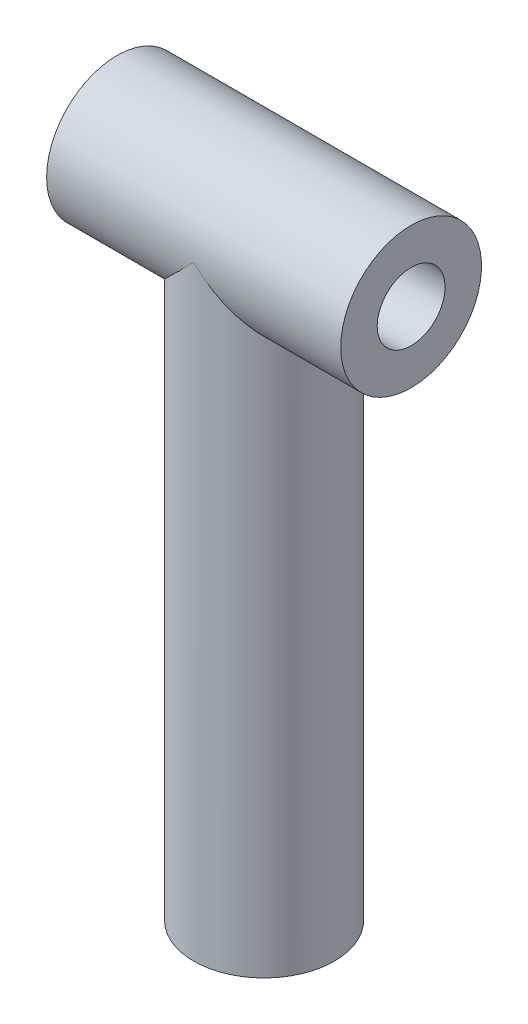
ISO-10303-21;
HEADER;
FILE_DESCRIPTION(('STEP AP214'),'2;1');
FILE_NAME('part.step','',(''),(''),'','','');
FILE_SCHEMA(('AUTOMOTIVE_DESIGN { 1 0 10303 214 1 1 1 1 }'));
ENDSEC;
DATA;
#1=APPLICATION_CONTEXT('core data for automotive mechanical design processes');
#2=APPLICATION_PROTOCOL_DEFINITION('international standard','automotive_design',2000,#1);
#3=PRODUCT_CONTEXT('',#1,'mechanical');
#4=PRODUCT('Part','Part','',(#3));
#5=PRODUCT_RELATED_PRODUCT_CATEGORY('part','',(#4));
#6=PRODUCT_DEFINITION_FORMATION('','',#4);
#7=PRODUCT_DEFINITION_CONTEXT('part definition',#1,'design');
#8=PRODUCT_DEFINITION('design','',#6,#7);
#9=PRODUCT_DEFINITION_SHAPE('','',#8);
#10=(LENGTH_UNIT() NAMED_UNIT(*) SI_UNIT(.MILLI.,.METRE.));
#11=(NAMED_UNIT(*) PLANE_ANGLE_UNIT() SI_UNIT($,.RADIAN.));
#12=(NAMED_UNIT(*) SI_UNIT($,.STERADIAN.) SOLID_ANGLE_UNIT());
#13=UNCERTAINTY_MEASURE_WITH_UNIT(LENGTH_MEASURE(1.E-05),#10,'distance_accuracy_value','');
#14=(GEOMETRIC_REPRESENTATION_CONTEXT(3) GLOBAL_UNCERTAINTY_ASSIGNED_CONTEXT((#13)) GLOBAL_UNIT_ASSIGNED_CONTEXT((#10,
#11,#12)) REPRESENTATION_CONTEXT('',''));
#15=CARTESIAN_POINT('',(0.,0.,0.));
#16=DIRECTION('',(0.,0.,1.));
#17=DIRECTION('',(1.,0.,0.));
#18=AXIS2_PLACEMENT_3D('',#15,#16,#17);
#19=CARTESIAN_POINT('',(0.,-107.,0.));
#20=DIRECTION('',(0.,1.,0.));
#21=DIRECTION('',(-1.,0.,0.));
#22=AXIS2_PLACEMENT_3D('',#19,#20,#21);
#23=CYLINDRICAL_SURFACE('',#22,5.);
#24=CARTESIAN_POINT('',(0.,-107.,0.));
#25=DIRECTION('',(0.,-1.,0.));
#26=DIRECTION('',(0.,0.,-1.));
#27=AXIS2_PLACEMENT_3D('',#24,#25,#26);
#28=CIRCLE('',#27,5.);
#29=CARTESIAN_POINT('',(0.,-107.,-5.));
#30=VERTEX_POINT('',#29);
#31=EDGE_CURVE('E98',#30,#30,#28,.T.);
#32=ORIENTED_EDGE('',*,*,#31,.T.);
#33=EDGE_LOOP('',(#32));
#34=FACE_BOUND('',#33,.T.);
#35=CARTESIAN_POINT('',(-5.,-12.445,0.));
#36=CARTESIAN_POINT('',(-4.99999921047016,-12.4449993836226,0.134380254248716));
#37=CARTESIAN_POINT('',(-4.99457509902374,-12.4428173961819,0.268811701853451));
#38=CARTESIAN_POINT('',(-4.97292780578596,-12.4341441176473,0.536722817996621));
#39=CARTESIAN_POINT('',(-4.95669745091969,-12.427649964189,0.67020179477194));
#40=CARTESIAN_POINT('',(-4.91355483179077,-12.4105057675391,0.935450702998557));
#41=CARTESIAN_POINT('',(-4.8866197706602,-12.399846855851,1.06721636325314));
#42=CARTESIAN_POINT('',(-4.82232747810782,-12.3746512557263,1.32785009255037));
#43=CARTESIAN_POINT('',(-4.78496598766992,-12.3601129827441,1.45671695418947));
#44=CARTESIAN_POINT('',(-4.70032985845046,-12.3275952396027,1.7101684260216));
#45=CARTESIAN_POINT('',(-4.65309264120023,-12.3096287814945,1.83476719187736));
#46=CARTESIAN_POINT('',(-4.54903318547114,-12.270672675897,2.079422416411));
#47=CARTESIAN_POINT('',(-4.49220736643891,-12.2496818995032,2.19947715769068));
#48=CARTESIAN_POINT('',(-4.30807871747373,-12.1829562937423,2.55155778451658));
#49=CARTESIAN_POINT('',(-4.16700669253554,-12.1334210621928,2.77585066122813));
#50=CARTESIAN_POINT('',(-3.84535504230426,-12.0266700031555,3.20764348432933));
#51=CARTESIAN_POINT('',(-3.66333069302464,-11.9692146605407,3.41399770947514));
#52=CARTESIAN_POINT('',(-3.26776469169965,-11.8541390779141,3.79432502613101));
#53=CARTESIAN_POINT('',(-3.05420759279374,-11.7965187707346,3.96828215238306));
#54=CARTESIAN_POINT('',(-2.70894461457719,-11.7133741209669,4.20503800338128));
#55=CARTESIAN_POINT('',(-2.58677461876584,-11.6856481327156,4.28128417227532));
#56=CARTESIAN_POINT('',(-2.33591639867659,-11.6326920062783,4.42314649094717));
#57=CARTESIAN_POINT('',(-2.20723088556697,-11.6074608426701,4.48876701520613));
#58=CARTESIAN_POINT('',(-1.94414888362959,-11.5603196732421,4.60881761007232));
#59=CARTESIAN_POINT('',(-1.80975202357346,-11.5384098837304,4.66324695192411));
#60=CARTESIAN_POINT('',(-1.53625430263286,-11.4986875533763,4.76035329833519));
#61=CARTESIAN_POINT('',(-1.39715584407928,-11.480872955296,4.80303620590282));
#62=CARTESIAN_POINT('',(-1.12164575793701,-11.4506865516449,4.8745503573854));
#63=CARTESIAN_POINT('',(-0.985397001964823,-11.438105076384,4.90392062765328));
#64=CARTESIAN_POINT('',(-0.710630029921596,-11.4177171072832,4.95120455235665));
#65=CARTESIAN_POINT('',(-0.572112870401013,-11.4099084519124,4.96912339312245));
#66=CARTESIAN_POINT('',(-0.293902004905635,-11.3993458489863,4.99330694472799));
#67=CARTESIAN_POINT('',(-0.154208559563968,-11.3965908098296,4.99957417236699));
#68=CARTESIAN_POINT('',(0.125215414153549,-11.3962357065788,5.00038379743066));
#69=CARTESIAN_POINT('',(0.264945940465497,-11.3986353989332,4.99492674880572));
#70=CARTESIAN_POINT('',(0.533442648235798,-11.4081493197636,4.97315593213459));
#71=CARTESIAN_POINT('',(0.662286374470262,-11.4149187002914,4.95763594217608));
#72=CARTESIAN_POINT('',(0.918140296182278,-11.4326161440291,4.91668689747132));
#73=CARTESIAN_POINT('',(1.04514987434996,-11.443545574999,4.89125458364115));
#74=CARTESIAN_POINT('',(1.29642210254544,-11.4692250850472,4.83073290249631));
#75=CARTESIAN_POINT('',(1.42068540270105,-11.4839742491317,4.79564584779066));
#76=CARTESIAN_POINT('',(1.66574422108091,-11.5168550359144,4.71613380674706));
#77=CARTESIAN_POINT('',(1.78653838578107,-11.5349879586816,4.67170523048239));
#78=CARTESIAN_POINT('',(2.14741152644033,-11.5945044599367,4.52295289096543));
#79=CARTESIAN_POINT('',(2.38103479478714,-11.6404713886928,4.40435783440319));
#80=CARTESIAN_POINT('',(2.82580554124556,-11.7395047901116,4.13313675238712));
#81=CARTESIAN_POINT('',(3.03694448669699,-11.7925739409039,3.98049787503238));
#82=CARTESIAN_POINT('',(3.44824147895701,-11.9048840812503,3.63151700800595));
#83=CARTESIAN_POINT('',(3.64625630498461,-11.9642834986836,3.4326938612438));
#84=CARTESIAN_POINT('',(4.00687795294106,-12.0790641038833,3.00388411082178));
#85=CARTESIAN_POINT('',(4.16947759813952,-12.1344444756944,2.77389120603769));
#86=CARTESIAN_POINT('',(4.3846237458889,-12.210584175859,2.40743959414935));
#87=CARTESIAN_POINT('',(4.45208797632576,-12.2350236946023,2.2802851101961));
#88=CARTESIAN_POINT('',(4.57598475336916,-12.2806487869271,2.02016868125749));
#89=CARTESIAN_POINT('',(4.63242181388257,-12.3018356911828,1.88720913992153));
#90=CARTESIAN_POINT('',(4.73371113281972,-12.3403343918904,1.61643947642039));
#91=CARTESIAN_POINT('',(4.77856568905935,-12.3576469568689,1.47863032252798));
#92=CARTESIAN_POINT('',(4.85623015201413,-12.3878857894599,1.19918765146138));
#93=CARTESIAN_POINT('',(4.8890409010387,-12.4008123638113,1.05755440247752));
#94=CARTESIAN_POINT('',(4.94064850647044,-12.4212522453434,0.780183727540192));
#95=CARTESIAN_POINT('',(4.96016632972264,-12.429043142911,0.644600511669062));
#96=CARTESIAN_POINT('',(4.98801976827636,-12.4401849641202,0.372057424985205));
#97=CARTESIAN_POINT('',(4.99635156606599,-12.4435343719872,0.23509710025694));
#98=CARTESIAN_POINT('',(5.00172546871138,-12.4456931048391,-0.0389960735936242));
#99=CARTESIAN_POINT('',(4.99877447047721,-12.4445052033758,-0.176128766112535));
#100=CARTESIAN_POINT('',(4.98162782933759,-12.4376275441603,-0.449626725995296));
#101=CARTESIAN_POINT('',(4.96742806364528,-12.4319361358284,-0.585991693521827));
#102=CARTESIAN_POINT('',(4.92884178255629,-12.4165699753529,-0.850630160306436));
#103=CARTESIAN_POINT('',(4.90495241461648,-12.4070899158576,-0.978987893973665));
#104=CARTESIAN_POINT('',(4.84729560993367,-12.384409464634,-1.23317359907332));
#105=CARTESIAN_POINT('',(4.81352471519742,-12.3712077705965,-1.35900066840996));
#106=CARTESIAN_POINT('',(4.73641864082605,-12.3414108302255,-1.60723969657171));
#107=CARTESIAN_POINT('',(4.69308623055802,-12.3248165666072,-1.72965263271533));
#108=CARTESIAN_POINT('',(4.59721862245418,-12.2886322829491,-1.97037922624301));
#109=CARTESIAN_POINT('',(4.5446799234358,-12.2690411235413,-2.08869130347873));
#110=CARTESIAN_POINT('',(4.37038023332567,-12.2051730672862,-2.44345163702831));
#111=CARTESIAN_POINT('',(4.23424428226286,-12.1567292019866,-2.67228894079636));
#112=CARTESIAN_POINT('',(3.92835596133021,-12.0536021212841,-3.10455772291127));
#113=CARTESIAN_POINT('',(3.75859005399423,-11.9989163970409,-3.30797891625889));
#114=CARTESIAN_POINT('',(3.3769936154928,-11.8847289464109,-3.69800092200719));
#115=CARTESIAN_POINT('',(3.16311467792,-11.8251490245893,-3.88257941482411));
#116=CARTESIAN_POINT('',(2.7062143316647,-11.7112296926489,-4.21377636663199));
#117=CARTESIAN_POINT('',(2.4631879525536,-11.6568911791911,-4.36038833779732));
#118=CARTESIAN_POINT('',(2.08018132434986,-11.5840042253345,-4.54900696924889));
#119=CARTESIAN_POINT('',(1.9486469815508,-11.5610417255506,-4.60689727058004));
#120=CARTESIAN_POINT('',(1.68057173475836,-11.5188917332297,-4.71129845268958));
#121=CARTESIAN_POINT('',(1.54403303831837,-11.499702599383,-4.75781428320167));
#122=CARTESIAN_POINT('',(1.26699101422928,-11.4657923054734,-4.83896349754224));
#123=CARTESIAN_POINT('',(1.12648929693441,-11.4510693583889,-4.87360163462804));
#124=CARTESIAN_POINT('',(0.842590920923086,-11.4266354414021,-4.93061802310077));
#125=CARTESIAN_POINT('',(0.699194508690543,-11.41692404662,-4.95299731380356));
#126=CARTESIAN_POINT('',(0.421236724016024,-11.4034036797107,-4.98404171145953));
#127=CARTESIAN_POINT('',(0.286791210111253,-11.3992168265085,-4.99358579726783));
#128=CARTESIAN_POINT('',(0.0174554952301754,-11.3956217573602,-5.00178482832082));
#129=CARTESIAN_POINT('',(-0.117434839806556,-11.3962151451335,-5.00043611914974));
#130=CARTESIAN_POINT('',(-0.38649082188665,-11.4021628908075,-4.98685875641103));
#131=CARTESIAN_POINT('',(-0.520656799545218,-11.4075148519658,-4.97463557996516));
#132=CARTESIAN_POINT('',(-0.787356920060131,-11.4227939478067,-4.93945036446845));
#133=CARTESIAN_POINT('',(-0.919890428571076,-11.4327228067662,-4.91648427814056));
#134=CARTESIAN_POINT('',(-1.176963993031,-11.4563328744432,-4.86120623466502));
#135=CARTESIAN_POINT('',(-1.30160977892854,-11.4698448125436,-4.8293129506677));
#136=CARTESIAN_POINT('',(-1.54769956790173,-11.5003677188003,-4.756167541315));
#137=CARTESIAN_POINT('',(-1.66914244331863,-11.5173799012246,-4.71491216764917));
#138=CARTESIAN_POINT('',(-2.02753552486303,-11.5729597606577,-4.57760125139047));
#139=CARTESIAN_POINT('',(-2.25873346268988,-11.6160886798235,-4.46796107341196));
#140=CARTESIAN_POINT('',(-2.71318935663733,-11.7126905388226,-4.20845602734985));
#141=CARTESIAN_POINT('',(-2.9352237603408,-11.7666160706689,-4.05663865533158));
#142=CARTESIAN_POINT('',(-3.35188508597662,-11.8774072256604,-3.71975268630043));
#143=CARTESIAN_POINT('',(-3.5465035811833,-11.9342737454555,-3.53467390545923));
#144=CARTESIAN_POINT('',(-3.82039083436652,-12.019368120646,-3.22878620888707));
#145=CARTESIAN_POINT('',(-3.91111058258957,-12.0485781529551,-3.11828305034802));
#146=CARTESIAN_POINT('',(-4.08291917786465,-12.1054403907438,-2.88966903065683));
#147=CARTESIAN_POINT('',(-4.16401149034221,-12.1330931548713,-2.77156093068234));
#148=CARTESIAN_POINT('',(-4.31603216169286,-12.1861017403326,-2.52833149185275));
#149=CARTESIAN_POINT('',(-4.38695093560296,-12.2114553873973,-2.40320369177869));
#150=CARTESIAN_POINT('',(-4.51791558839929,-12.259113625417,-2.1468899554537));
#151=CARTESIAN_POINT('',(-4.57796645185345,-12.2814196130252,-2.01570683130442));
#152=CARTESIAN_POINT('',(-4.68569232324595,-12.3219840767378,-1.75054233472229));
#153=CARTESIAN_POINT('',(-4.73357002843731,-12.3403079866013,-1.61665338433405));
#154=CARTESIAN_POINT('',(-4.81783289906416,-12.372874687531,-1.34488373765285));
#155=CARTESIAN_POINT('',(-4.85422346888107,-12.3871193974549,-1.20700495189964));
#156=CARTESIAN_POINT('',(-4.91506943699304,-12.4110898918369,-0.928625220716788));
#157=CARTESIAN_POINT('',(-4.93955475551587,-12.4208270017918,-0.78813177980313));
#158=CARTESIAN_POINT('',(-4.9764322597395,-12.4355383497969,-0.50539113958929));
#159=CARTESIAN_POINT('',(-4.98883357202466,-12.4405161822924,-0.363145346129096));
#160=CARTESIAN_POINT('',(-4.99675263634713,-12.443695676603,-0.183898995686314));
#161=CARTESIAN_POINT('',(-4.99797012102503,-12.4441845802107,-0.147132531109211));
#162=CARTESIAN_POINT('',(-4.99959391085446,-12.4448368262554,-0.0735786568029203));
#163=CARTESIAN_POINT('',(-5.00000021616113,-12.4450001687546,-0.0367912470777392));
#164=CARTESIAN_POINT('',(-5.,-12.445,0.));
#165=B_SPLINE_CURVE_WITH_KNOTS('',3,(#35,#36,#37,#38,#39,#40,#41,#42,#43,#44,#45,#46,#47,#48,
#49,#50,#51,#52,#53,#54,#55,#56,#57,#58,#59,#60,#61,#62,#63,#64,#65,#66,#67,#68,#69,#70,#71,#72,
#73,#74,#75,#76,#77,#78,#79,#80,#81,#82,#83,#84,#85,#86,#87,#88,#89,#90,#91,#92,#93,#94,#95,#96,
#97,#98,#99,#100,#101,#102,#103,#104,#105,#106,#107,#108,#109,#110,#111,#112,#113,#114,#115,
#116,#117,#118,#119,#120,#121,#122,#123,#124,#125,#126,#127,#128,#129,#130,#131,#132,#133,#134,
#135,#136,#137,#138,#139,#140,#141,#142,#143,#144,#145,#146,#147,#148,#149,#150,#151,#152,#153,
#154,#155,#156,#157,#158,#159,#160,#161,#162,#163,#164),.UNSPECIFIED.,.T.,.F.,(4,2,2,2,2,2,2,2,
2,2,2,2,2,2,2,2,2,2,2,2,2,2,2,2,2,2,2,2,2,2,2,2,2,2,2,2,2,2,2,2,2,2,2,2,2,2,2,2,2,2,2,2,2,2,2,2,
2,2,2,2,2,2,2,2,4),(0.,0.403102977725288,0.806473798245664,1.21070828502652,1.6151081369131,
2.01800252629888,2.42104769787075,3.22603246277048,4.06582999775594,4.90604029532706,
5.3455496942421,5.78487768855411,6.22423428228731,6.66336967856714,7.0826502642342,
7.5017408237086,7.92074084727127,8.33972107429242,8.72911791721986,9.11864289851775,
9.5080746576351,9.89765634897667,10.6919920899354,11.4866282100969,12.3432846827139,
13.2001145918092,13.6376528658497,14.0750116592207,14.5122836196067,14.9495249926134,
15.3606076898873,15.7718306438157,16.182802266943,16.5939245850472,16.9861885745325,
17.3785899994409,17.7708779192796,18.1633153526093,18.9714400637709,19.7798907424474,
20.6421804680022,21.5046174469524,21.9407369433984,22.3766663182655,22.8124210372265,
23.2481388067961,23.6521699494815,24.0563366459071,24.4602998916531,24.8644154489794,
25.2520743831579,25.6398680273375,26.4148965774801,27.2345477194313,28.0544502473574,
28.4917896894705,28.9289712295093,29.3665619908691,29.8039515397302,30.2334942605541,
30.6628345910938,31.0910902552057,31.5190222230333,31.6293856404158,31.7397490366914),.UNSPECIFIED.);
#166=CARTESIAN_POINT('',(-5.,-12.445,0.));
#167=VERTEX_POINT('',#166);
#168=EDGE_CURVE('E62',#167,#167,#165,.T.);
#169=ORIENTED_EDGE('',*,*,#168,.T.);
#170=EDGE_LOOP('',(#169));
#171=FACE_BOUND('',#170,.T.);
#172=ADVANCED_FACE('F57',(#34,#171),#23,.F.);
#173=CARTESIAN_POINT('',(0.,-107.,0.));
#174=DIRECTION('',(0.,1.,0.));
#175=DIRECTION('',(-1.,0.,0.));
#176=AXIS2_PLACEMENT_3D('',#173,#174,#175);
#177=CYLINDRICAL_SURFACE('',#176,12.445);
#178=CARTESIAN_POINT('',(0.,-107.,0.));
#179=DIRECTION('',(0.,-1.,0.));
#180=DIRECTION('',(0.,0.,-1.));
#181=AXIS2_PLACEMENT_3D('',#178,#179,#180);
#182=CIRCLE('',#181,12.445);
#183=CARTESIAN_POINT('',(0.,-107.,-12.445));
#184=VERTEX_POINT('',#183);
#185=EDGE_CURVE('E79',#184,#184,#182,.T.);
#186=ORIENTED_EDGE('',*,*,#185,.F.);
#187=EDGE_LOOP('',(#186));
#188=FACE_BOUND('',#187,.T.);
#189=CARTESIAN_POINT('',(0.,0.,0.));
#190=DIRECTION('',(-0.707106781186547,0.707106781186547,0.));
#191=DIRECTION('',(0.707106781186547,0.707106781186548,0.));
#192=AXIS2_PLACEMENT_3D('',#189,#190,#191);
#193=ELLIPSE('',#192,17.5998877837332,12.445);
#194=CARTESIAN_POINT('',(0.,0.,-12.445));
#195=VERTEX_POINT('',#194);
#196=CARTESIAN_POINT('',(0.,0.,12.445));
#197=VERTEX_POINT('',#196);
#198=EDGE_CURVE('E72',#195,#197,#193,.T.);
#199=ORIENTED_EDGE('',*,*,#198,.F.);
#200=CARTESIAN_POINT('',(0.,0.,0.));
#201=DIRECTION('',(0.707106781186547,0.707106781186548,0.));
#202=DIRECTION('',(-0.707106781186547,0.707106781186547,0.));
#203=AXIS2_PLACEMENT_3D('',#200,#201,#202);
#204=ELLIPSE('',#203,17.5998877837332,12.445);
#205=EDGE_CURVE('E13',#197,#195,#204,.T.);
#206=ORIENTED_EDGE('',*,*,#205,.F.);
#207=EDGE_LOOP('',(#199,#206));
#208=FACE_BOUND('',#207,.T.);
#209=ADVANCED_FACE('F81',(#188,#208),#177,.T.);
#210=CARTESIAN_POINT('',(0.,-107.,0.));
#211=DIRECTION('',(0.,-1.,0.));
#212=DIRECTION('',(0.,0.,-1.));
#213=AXIS2_PLACEMENT_3D('',#210,#211,#212);
#214=PLANE('',#213);
#215=ORIENTED_EDGE('',*,*,#31,.F.);
#216=EDGE_LOOP('',(#215));
#217=FACE_BOUND('',#216,.T.);
#218=ORIENTED_EDGE('',*,*,#185,.T.);
#219=EDGE_LOOP('',(#218));
#220=FACE_BOUND('',#219,.T.);
#221=ADVANCED_FACE('F83',(#217,#220),#214,.T.);
#222=CARTESIAN_POINT('',(26.,0.,0.));
#223=DIRECTION('',(-1.,0.,0.));
#224=DIRECTION('',(0.,0.,1.));
#225=AXIS2_PLACEMENT_3D('',#222,#223,#224);
#226=CYLINDRICAL_SURFACE('',#225,12.445);
#227=ORIENTED_EDGE('',*,*,#168,.F.);
#228=EDGE_LOOP('',(#227));
#229=FACE_BOUND('',#228,.T.);
#230=ORIENTED_EDGE('',*,*,#198,.T.);
#231=ORIENTED_EDGE('',*,*,#205,.T.);
#232=EDGE_LOOP('',(#230,#231));
#233=FACE_BOUND('',#232,.T.);
#234=ADVANCED_FACE('F59',(#229,#233),#226,.F.);
#235=CLOSED_SHELL('',(#172,#209,#221,#234));
#236=MANIFOLD_SOLID_BREP('B2',#235);
#237=CARTESIAN_POINT('',(26.,0.,0.));
#238=DIRECTION('',(-1.,0.,0.));
#239=DIRECTION('',(0.,0.,1.));
#240=AXIS2_PLACEMENT_3D('',#237,#238,#239);
#241=CYLINDRICAL_SURFACE('',#240,12.445);
#242=CARTESIAN_POINT('',(26.,0.,0.));
#243=DIRECTION('',(1.,0.,0.));
#244=DIRECTION('',(0.,0.,-1.));
#245=AXIS2_PLACEMENT_3D('',#242,#243,#244);
#246=CIRCLE('',#245,12.445);
#247=CARTESIAN_POINT('',(26.,0.,12.445));
#248=VERTEX_POINT('',#247);
#249=EDGE_CURVE('E56',#248,#248,#246,.T.);
#250=CARTESIAN_POINT('',(-26.,0.,0.));
#251=DIRECTION('',(1.,0.,0.));
#252=DIRECTION('',(0.,0.,-1.));
#253=AXIS2_PLACEMENT_3D('',#250,#251,#252);
#254=CIRCLE('',#253,12.445);
#255=CARTESIAN_POINT('',(-26.,0.,12.445));
#256=VERTEX_POINT('',#255);
#257=EDGE_CURVE('E162',#256,#256,#254,.T.);
#258=CARTESIAN_POINT('',(26.,0.,12.445));
#259=CARTESIAN_POINT('',(25.4583333333333,0.,12.445));
#260=CARTESIAN_POINT('',(24.9166666666667,0.,12.445));
#261=CARTESIAN_POINT('',(23.8333333333333,0.,12.445));
#262=CARTESIAN_POINT('',(23.2916666666667,0.,12.445));
#263=CARTESIAN_POINT('',(22.2083333333333,0.,12.445));
#264=CARTESIAN_POINT('',(21.6666666666667,0.,12.445));
#265=CARTESIAN_POINT('',(20.5833333333333,0.,12.445));
#266=CARTESIAN_POINT('',(20.0416666666667,0.,12.445));
#267=CARTESIAN_POINT('',(18.9583333333333,0.,12.445));
#268=CARTESIAN_POINT('',(18.4166666666667,0.,12.445));
#269=CARTESIAN_POINT('',(17.3333333333333,0.,12.445));
#270=CARTESIAN_POINT('',(16.7916666666667,0.,12.445));
#271=CARTESIAN_POINT('',(15.7083333333333,0.,12.445));
#272=CARTESIAN_POINT('',(15.1666666666667,0.,12.445));
#273=CARTESIAN_POINT('',(14.0833333333333,0.,12.445));
#274=CARTESIAN_POINT('',(13.5416666666667,0.,12.445));
#275=CARTESIAN_POINT('',(12.4583333333333,0.,12.445));
#276=CARTESIAN_POINT('',(11.9166666666667,0.,12.445));
#277=CARTESIAN_POINT('',(10.8333333333333,0.,12.445));
#278=CARTESIAN_POINT('',(10.2916666666667,0.,12.445));
#279=CARTESIAN_POINT('',(9.20833333333333,0.,12.445));
#280=CARTESIAN_POINT('',(8.66666666666666,0.,12.445));
#281=CARTESIAN_POINT('',(7.58333333333333,0.,12.445));
#282=CARTESIAN_POINT('',(7.04166666666666,0.,12.445));
#283=CARTESIAN_POINT('',(5.95833333333333,0.,12.445));
#284=CARTESIAN_POINT('',(5.41666666666666,0.,12.445));
#285=CARTESIAN_POINT('',(4.33333333333333,0.,12.445));
#286=CARTESIAN_POINT('',(3.79166666666666,0.,12.445));
#287=CARTESIAN_POINT('',(2.70833333333333,0.,12.445));
#288=CARTESIAN_POINT('',(2.16666666666666,0.,12.445));
#289=CARTESIAN_POINT('',(1.08333333333333,0.,12.445));
#290=CARTESIAN_POINT('',(0.541666666666664,0.,12.445));
#291=CARTESIAN_POINT('',(-0.54166666666667,0.,12.445));
#292=CARTESIAN_POINT('',(-1.08333333333334,0.,12.445));
#293=CARTESIAN_POINT('',(-2.16666666666667,0.,12.445));
#294=CARTESIAN_POINT('',(-2.70833333333334,0.,12.445));
#295=CARTESIAN_POINT('',(-3.79166666666667,0.,12.445));
#296=CARTESIAN_POINT('',(-4.33333333333334,0.,12.445));
#297=CARTESIAN_POINT('',(-5.41666666666667,0.,12.445));
#298=CARTESIAN_POINT('',(-5.95833333333333,0.,12.445));
#299=CARTESIAN_POINT('',(-7.04166666666666,0.,12.445));
#300=CARTESIAN_POINT('',(-7.58333333333333,0.,12.445));
#301=CARTESIAN_POINT('',(-8.66666666666666,0.,12.445));
#302=CARTESIAN_POINT('',(-9.20833333333333,0.,12.445));
#303=CARTESIAN_POINT('',(-10.2916666666667,0.,12.445));
#304=CARTESIAN_POINT('',(-10.8333333333333,0.,12.445));
#305=CARTESIAN_POINT('',(-11.9166666666667,0.,12.445));
#306=CARTESIAN_POINT('',(-12.4583333333333,0.,12.445));
#307=CARTESIAN_POINT('',(-13.5416666666667,0.,12.445));
#308=CARTESIAN_POINT('',(-14.0833333333333,0.,12.445));
#309=CARTESIAN_POINT('',(-15.1666666666667,0.,12.445));
#310=CARTESIAN_POINT('',(-15.7083333333333,0.,12.445));
#311=CARTESIAN_POINT('',(-16.7916666666667,0.,12.445));
#312=CARTESIAN_POINT('',(-17.3333333333333,0.,12.445));
#313=CARTESIAN_POINT('',(-18.4166666666667,0.,12.445));
#314=CARTESIAN_POINT('',(-18.9583333333333,0.,12.445));
#315=CARTESIAN_POINT('',(-20.0416666666667,0.,12.445));
#316=CARTESIAN_POINT('',(-20.5833333333333,0.,12.445));
#317=CARTESIAN_POINT('',(-21.6666666666667,0.,12.445));
#318=CARTESIAN_POINT('',(-22.2083333333333,0.,12.445));
#319=CARTESIAN_POINT('',(-23.2916666666667,0.,12.445));
#320=CARTESIAN_POINT('',(-23.8333333333333,0.,12.445));
#321=CARTESIAN_POINT('',(-24.9166666666667,0.,12.445));
#322=CARTESIAN_POINT('',(-25.4583333333333,0.,12.445));
#323=CARTESIAN_POINT('',(-26.,0.,12.445));
#324=B_SPLINE_CURVE_WITH_KNOTS('',3,(#258,#259,#260,#261,#262,#263,#264,#265,#266,#267,#268,
#269,#270,#271,#272,#273,#274,#275,#276,#277,#278,#279,#280,#281,#282,#283,#284,#285,#286,#287,
#288,#289,#290,#291,#292,#293,#294,#295,#296,#297,#298,#299,#300,#301,#302,#303,#304,#305,#306,
#307,#308,#309,#310,#311,#312,#313,#314,#315,#316,#317,#318,#319,#320,#321,#322,#323),
.UNSPECIFIED.,.F.,.F.,(4,2,2,2,2,2,2,2,2,2,2,2,2,2,2,2,2,2,2,2,2,2,2,2,2,2,2,2,2,2,2,2,4),(0.,
1.625,3.25,4.875,6.5,8.125,9.75,11.375,13.,14.625,16.25,17.875,19.5,21.125,22.75,24.375,26.,
27.625,29.25,30.875,32.5,34.125,35.75,37.375,39.,40.625,42.25,43.875,45.5,47.125,48.75,50.375,
52.),.UNSPECIFIED.);
#325=EDGE_CURVE('BSEAM159',#248,#256,#324,.T.);
#326=ORIENTED_EDGE('',*,*,#249,.F.);
#327=ORIENTED_EDGE('',*,*,#257,.T.);
#328=ORIENTED_EDGE('',*,*,#325,.T.);
#329=ORIENTED_EDGE('',*,*,#325,.F.);
#330=EDGE_LOOP('',(#326,#328,#327,#329));
#331=FACE_BOUND('',#330,.T.);
#332=ADVANCED_FACE('F159',(#331),#241,.T.);
#333=CARTESIAN_POINT('',(26.,0.,0.));
#334=DIRECTION('',(1.,0.,0.));
#335=DIRECTION('',(0.,0.,-1.));
#336=AXIS2_PLACEMENT_3D('',#333,#334,#335);
#337=PLANE('',#336);
#338=CARTESIAN_POINT('',(26.,0.,0.));
#339=DIRECTION('',(1.,0.,0.));
#340=DIRECTION('',(0.,0.,-1.));
#341=AXIS2_PLACEMENT_3D('',#338,#339,#340);
#342=CIRCLE('',#341,6.);
#343=CARTESIAN_POINT('',(26.,0.,6.));
#344=VERTEX_POINT('',#343);
#345=EDGE_CURVE('E169',#344,#344,#342,.T.);
#346=ORIENTED_EDGE('',*,*,#345,.F.);
#347=EDGE_LOOP('',(#346));
#348=FACE_BOUND('',#347,.T.);
#349=ORIENTED_EDGE('',*,*,#249,.T.);
#350=EDGE_LOOP('',(#349));
#351=FACE_BOUND('',#350,.T.);
#352=ADVANCED_FACE('F182',(#348,#351),#337,.T.);
#353=CARTESIAN_POINT('',(-26.,0.,0.));
#354=DIRECTION('',(1.,0.,0.));
#355=DIRECTION('',(0.,0.,-1.));
#356=AXIS2_PLACEMENT_3D('',#353,#354,#355);
#357=PLANE('',#356);
#358=CARTESIAN_POINT('',(-26.,0.,0.));
#359=DIRECTION('',(-1.,0.,0.));
#360=DIRECTION('',(0.,0.,1.));
#361=AXIS2_PLACEMENT_3D('',#358,#359,#360);
#362=CIRCLE('',#361,6.);
#363=CARTESIAN_POINT('',(-26.,0.,6.));
#364=VERTEX_POINT('',#363);
#365=EDGE_CURVE('E173',#364,#364,#362,.T.);
#366=ORIENTED_EDGE('',*,*,#365,.F.);
#367=EDGE_LOOP('',(#366));
#368=FACE_BOUND('',#367,.T.);
#369=ORIENTED_EDGE('',*,*,#257,.F.);
#370=EDGE_LOOP('',(#369));
#371=FACE_BOUND('',#370,.T.);
#372=ADVANCED_FACE('F179',(#368,#371),#357,.F.);
#373=CARTESIAN_POINT('',(31.,0.,0.));
#374=DIRECTION('',(-1.,0.,0.));
#375=DIRECTION('',(0.,0.,1.));
#376=AXIS2_PLACEMENT_3D('',#373,#374,#375);
#377=CYLINDRICAL_SURFACE('',#376,6.);
#378=CARTESIAN_POINT('',(26.,0.,6.));
#379=CARTESIAN_POINT('',(25.4583333333333,0.,6.));
#380=CARTESIAN_POINT('',(24.9166666666667,0.,6.));
#381=CARTESIAN_POINT('',(23.8333333333333,0.,6.));
#382=CARTESIAN_POINT('',(23.2916666666667,0.,6.));
#383=CARTESIAN_POINT('',(22.2083333333333,0.,6.));
#384=CARTESIAN_POINT('',(21.6666666666667,0.,6.));
#385=CARTESIAN_POINT('',(20.5833333333333,0.,6.));
#386=CARTESIAN_POINT('',(20.0416666666667,0.,6.));
#387=CARTESIAN_POINT('',(18.9583333333333,0.,6.));
#388=CARTESIAN_POINT('',(18.4166666666667,0.,6.));
#389=CARTESIAN_POINT('',(17.3333333333333,0.,6.));
#390=CARTESIAN_POINT('',(16.7916666666667,0.,6.));
#391=CARTESIAN_POINT('',(15.7083333333333,0.,6.));
#392=CARTESIAN_POINT('',(15.1666666666667,0.,6.));
#393=CARTESIAN_POINT('',(14.0833333333333,0.,6.));
#394=CARTESIAN_POINT('',(13.5416666666667,0.,6.));
#395=CARTESIAN_POINT('',(12.4583333333333,0.,6.));
#396=CARTESIAN_POINT('',(11.9166666666667,0.,6.));
#397=CARTESIAN_POINT('',(10.8333333333333,0.,6.));
#398=CARTESIAN_POINT('',(10.2916666666667,0.,6.));
#399=CARTESIAN_POINT('',(9.20833333333333,0.,6.));
#400=CARTESIAN_POINT('',(8.66666666666667,0.,6.));
#401=CARTESIAN_POINT('',(7.58333333333333,0.,6.));
#402=CARTESIAN_POINT('',(7.04166666666667,0.,6.));
#403=CARTESIAN_POINT('',(5.95833333333333,0.,6.));
#404=CARTESIAN_POINT('',(5.41666666666667,0.,6.));
#405=CARTESIAN_POINT('',(4.33333333333334,0.,6.));
#406=CARTESIAN_POINT('',(3.79166666666667,0.,6.));
#407=CARTESIAN_POINT('',(2.70833333333334,0.,6.));
#408=CARTESIAN_POINT('',(2.16666666666667,0.,6.));
#409=CARTESIAN_POINT('',(1.08333333333333,0.,6.));
#410=CARTESIAN_POINT('',(0.541666666666667,0.,6.));
#411=CARTESIAN_POINT('',(-0.541666666666666,0.,6.));
#412=CARTESIAN_POINT('',(-1.08333333333333,0.,6.));
#413=CARTESIAN_POINT('',(-2.16666666666666,0.,6.));
#414=CARTESIAN_POINT('',(-2.70833333333333,0.,6.));
#415=CARTESIAN_POINT('',(-3.79166666666666,0.,6.));
#416=CARTESIAN_POINT('',(-4.33333333333333,0.,6.));
#417=CARTESIAN_POINT('',(-5.41666666666666,0.,6.));
#418=CARTESIAN_POINT('',(-5.95833333333333,0.,6.));
#419=CARTESIAN_POINT('',(-7.04166666666666,0.,6.));
#420=CARTESIAN_POINT('',(-7.58333333333333,0.,6.));
#421=CARTESIAN_POINT('',(-8.66666666666666,0.,6.));
#422=CARTESIAN_POINT('',(-9.20833333333332,0.,6.));
#423=CARTESIAN_POINT('',(-10.2916666666667,0.,6.));
#424=CARTESIAN_POINT('',(-10.8333333333333,0.,6.));
#425=CARTESIAN_POINT('',(-11.9166666666667,0.,6.));
#426=CARTESIAN_POINT('',(-12.4583333333333,0.,6.));
#427=CARTESIAN_POINT('',(-13.5416666666667,0.,6.));
#428=CARTESIAN_POINT('',(-14.0833333333333,0.,6.));
#429=CARTESIAN_POINT('',(-15.1666666666667,0.,6.));
#430=CARTESIAN_POINT('',(-15.7083333333333,0.,6.));
#431=CARTESIAN_POINT('',(-16.7916666666667,0.,6.));
#432=CARTESIAN_POINT('',(-17.3333333333333,0.,6.));
#433=CARTESIAN_POINT('',(-18.4166666666667,0.,6.));
#434=CARTESIAN_POINT('',(-18.9583333333333,0.,6.));
#435=CARTESIAN_POINT('',(-20.0416666666667,0.,6.));
#436=CARTESIAN_POINT('',(-20.5833333333333,0.,6.));
#437=CARTESIAN_POINT('',(-21.6666666666667,0.,6.));
#438=CARTESIAN_POINT('',(-22.2083333333333,0.,6.));
#439=CARTESIAN_POINT('',(-23.2916666666667,0.,6.));
#440=CARTESIAN_POINT('',(-23.8333333333333,0.,6.));
#441=CARTESIAN_POINT('',(-24.9166666666667,0.,6.));
#442=CARTESIAN_POINT('',(-25.4583333333333,0.,6.));
#443=CARTESIAN_POINT('',(-26.,0.,6.));
#444=B_SPLINE_CURVE_WITH_KNOTS('',3,(#378,#379,#380,#381,#382,#383,#384,#385,#386,#387,#388,
#389,#390,#391,#392,#393,#394,#395,#396,#397,#398,#399,#400,#401,#402,#403,#404,#405,#406,#407,
#408,#409,#410,#411,#412,#413,#414,#415,#416,#417,#418,#419,#420,#421,#422,#423,#424,#425,#426,
#427,#428,#429,#430,#431,#432,#433,#434,#435,#436,#437,#438,#439,#440,#441,#442,#443),
.UNSPECIFIED.,.F.,.F.,(4,2,2,2,2,2,2,2,2,2,2,2,2,2,2,2,2,2,2,2,2,2,2,2,2,2,2,2,2,2,2,2,4),(0.,
1.625,3.25,4.875,6.5,8.125,9.75,11.375,13.,14.625,16.25,17.875,19.5,21.125,22.75,24.375,26.,
27.625,29.25,30.875,32.5,34.125,35.75,37.375,39.,40.625,42.25,43.875,45.5,47.125,48.75,50.375,
52.),.UNSPECIFIED.);
#445=EDGE_CURVE('BSEAM177',#344,#364,#444,.T.);
#446=ORIENTED_EDGE('',*,*,#345,.T.);
#447=ORIENTED_EDGE('',*,*,#365,.T.);
#448=ORIENTED_EDGE('',*,*,#445,.T.);
#449=ORIENTED_EDGE('',*,*,#445,.F.);
#450=EDGE_LOOP('',(#446,#448,#447,#449));
#451=FACE_BOUND('',#450,.T.);
#452=ADVANCED_FACE('F177',(#451),#377,.F.);
#453=CLOSED_SHELL('',(#332,#352,#372,#452));
#454=MANIFOLD_SOLID_BREP('B7',#453);
#455=ADVANCED_BREP_SHAPE_REPRESENTATION('',(#18,#236,#454),#14);
#456=SHAPE_DEFINITION_REPRESENTATION(#9,#455);
ENDSEC;
END-ISO-10303-21;
